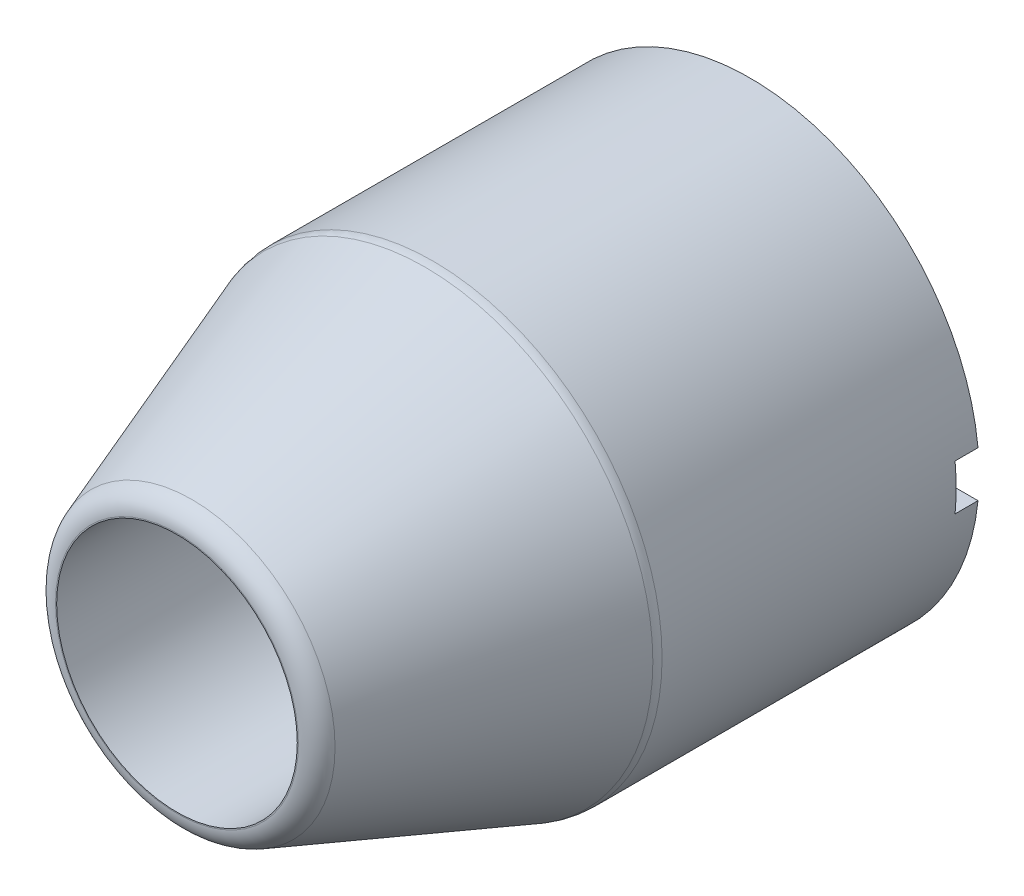
ISO-10303-21;
HEADER;
FILE_DESCRIPTION(('STEP AP214'),'2;1');
FILE_NAME('part.step','',(''),(''),'','','');
FILE_SCHEMA(('AUTOMOTIVE_DESIGN { 1 0 10303 214 1 1 1 1 }'));
ENDSEC;
DATA;
#1=APPLICATION_CONTEXT('core data for automotive mechanical design processes');
#2=APPLICATION_PROTOCOL_DEFINITION('international standard','automotive_design',2000,#1);
#3=PRODUCT_CONTEXT('',#1,'mechanical');
#4=PRODUCT('Part','Part','',(#3));
#5=PRODUCT_RELATED_PRODUCT_CATEGORY('part','',(#4));
#6=PRODUCT_DEFINITION_FORMATION('','',#4);
#7=PRODUCT_DEFINITION_CONTEXT('part definition',#1,'design');
#8=PRODUCT_DEFINITION('design','',#6,#7);
#9=PRODUCT_DEFINITION_SHAPE('','',#8);
#10=(LENGTH_UNIT() NAMED_UNIT(*) SI_UNIT(.MILLI.,.METRE.));
#11=(NAMED_UNIT(*) PLANE_ANGLE_UNIT() SI_UNIT($,.RADIAN.));
#12=(NAMED_UNIT(*) SI_UNIT($,.STERADIAN.) SOLID_ANGLE_UNIT());
#13=UNCERTAINTY_MEASURE_WITH_UNIT(LENGTH_MEASURE(1.E-05),#10,'distance_accuracy_value','');
#14=(GEOMETRIC_REPRESENTATION_CONTEXT(3) GLOBAL_UNCERTAINTY_ASSIGNED_CONTEXT((#13)) GLOBAL_UNIT_ASSIGNED_CONTEXT((#10,
#11,#12)) REPRESENTATION_CONTEXT('',''));
#15=CARTESIAN_POINT('',(0.,0.,0.));
#16=DIRECTION('',(0.,0.,1.));
#17=DIRECTION('',(1.,0.,0.));
#18=AXIS2_PLACEMENT_3D('',#15,#16,#17);
#19=CARTESIAN_POINT('',(0.,0.,0.));
#20=DIRECTION('',(0.,0.,1.));
#21=DIRECTION('',(1.,0.,0.));
#22=AXIS2_PLACEMENT_3D('',#19,#20,#21);
#23=PLANE('',#22);
#24=CARTESIAN_POINT('',(0.,0.,0.));
#25=DIRECTION('',(0.,0.,1.));
#26=DIRECTION('',(1.,0.,0.));
#27=AXIS2_PLACEMENT_3D('',#24,#25,#26);
#28=CIRCLE('',#27,10.);
#29=CARTESIAN_POINT('',(-9.9498743710662,-1.,0.));
#30=VERTEX_POINT('',#29);
#31=CARTESIAN_POINT('',(9.9498743710662,-1.,0.));
#32=VERTEX_POINT('',#31);
#33=EDGE_CURVE('E137',#30,#32,#28,.T.);
#34=ORIENTED_EDGE('',*,*,#33,.F.);
#35=DIRECTION('',(-1.,0.,0.));
#36=VECTOR('',#35,1.);
#37=CARTESIAN_POINT('',(11.2328509612834,-1.,0.));
#38=LINE('',#37,#36);
#39=CARTESIAN_POINT('',(-3.87298334620742,-1.,0.));
#40=VERTEX_POINT('',#39);
#41=EDGE_CURVE('E128',#40,#30,#38,.T.);
#42=ORIENTED_EDGE('',*,*,#41,.F.);
#43=CARTESIAN_POINT('',(0.,0.,0.));
#44=DIRECTION('',(0.,0.,1.));
#45=DIRECTION('',(1.,0.,0.));
#46=AXIS2_PLACEMENT_3D('',#43,#44,#45);
#47=CIRCLE('',#46,4.);
#48=CARTESIAN_POINT('',(3.87298334620742,-1.,0.));
#49=VERTEX_POINT('',#48);
#50=EDGE_CURVE('E136',#40,#49,#47,.T.);
#51=ORIENTED_EDGE('',*,*,#50,.T.);
#52=EDGE_CURVE('E226',#32,#49,#38,.T.);
#53=ORIENTED_EDGE('',*,*,#52,.F.);
#54=EDGE_LOOP('',(#34,#42,#51,#53));
#55=FACE_BOUND('',#54,.T.);
#56=ADVANCED_FACE('F39',(#55),#23,.F.);
#57=CARTESIAN_POINT('',(0.,0.,0.));
#58=DIRECTION('',(0.,0.,1.));
#59=DIRECTION('',(1.,0.,0.));
#60=AXIS2_PLACEMENT_3D('',#57,#58,#59);
#61=CYLINDRICAL_SURFACE('',#60,2.);
#62=CARTESIAN_POINT('',(0.,0.,2.00000000000001));
#63=DIRECTION('',(0.,0.,1.));
#64=DIRECTION('',(1.,0.,0.));
#65=AXIS2_PLACEMENT_3D('',#62,#63,#64);
#66=CIRCLE('',#65,2.);
#67=CARTESIAN_POINT('',(2.,0.,2.00000000000001));
#68=VERTEX_POINT('',#67);
#69=EDGE_CURVE('E149',#68,#68,#66,.F.);
#70=ORIENTED_EDGE('',*,*,#69,.T.);
#71=EDGE_LOOP('',(#70));
#72=FACE_BOUND('',#71,.T.);
#73=CARTESIAN_POINT('',(0.,0.,17.));
#74=DIRECTION('',(0.,0.,1.));
#75=DIRECTION('',(1.,0.,0.));
#76=AXIS2_PLACEMENT_3D('',#73,#74,#75);
#77=CIRCLE('',#76,2.);
#78=CARTESIAN_POINT('',(2.,0.,17.));
#79=VERTEX_POINT('',#78);
#80=EDGE_CURVE('E141',#79,#79,#77,.F.);
#81=ORIENTED_EDGE('',*,*,#80,.F.);
#82=EDGE_LOOP('',(#81));
#83=FACE_BOUND('',#82,.T.);
#84=ADVANCED_FACE('F196',(#72,#83),#61,.F.);
#85=CARTESIAN_POINT('',(0.,0.,25.));
#86=DIRECTION('',(0.,0.,-1.));
#87=DIRECTION('',(-1.,0.,0.));
#88=AXIS2_PLACEMENT_3D('',#85,#86,#87);
#89=CYLINDRICAL_SURFACE('',#88,10.);
#90=ORIENTED_EDGE('',*,*,#33,.T.);
#91=DIRECTION('',(0.,0.,-1.));
#92=VECTOR('',#91,1.);
#93=CARTESIAN_POINT('',(9.9498743710662,-1.,25.));
#94=LINE('',#93,#92);
#95=CARTESIAN_POINT('',(9.9498743710662,-1.,1.));
#96=VERTEX_POINT('',#95);
#97=EDGE_CURVE('E229',#32,#96,#94,.F.);
#98=ORIENTED_EDGE('',*,*,#97,.T.);
#99=CARTESIAN_POINT('',(0.,0.,1.));
#100=DIRECTION('',(0.,0.,-1.));
#101=DIRECTION('',(-1.,0.,0.));
#102=AXIS2_PLACEMENT_3D('',#99,#100,#101);
#103=CIRCLE('',#102,10.);
#104=CARTESIAN_POINT('',(9.9498743710662,1.,1.));
#105=VERTEX_POINT('',#104);
#106=EDGE_CURVE('E118',#105,#96,#103,.T.);
#107=ORIENTED_EDGE('',*,*,#106,.F.);
#108=DIRECTION('',(0.,0.,-1.));
#109=VECTOR('',#108,1.);
#110=CARTESIAN_POINT('',(9.9498743710662,1.,25.));
#111=LINE('',#110,#109);
#112=CARTESIAN_POINT('',(9.9498743710662,1.,0.));
#113=VERTEX_POINT('',#112);
#114=EDGE_CURVE('E117',#105,#113,#111,.T.);
#115=ORIENTED_EDGE('',*,*,#114,.T.);
#116=CARTESIAN_POINT('',(-9.9498743710662,1.,0.));
#117=VERTEX_POINT('',#116);
#118=EDGE_CURVE('E125',#113,#117,#28,.T.);
#119=ORIENTED_EDGE('',*,*,#118,.T.);
#120=DIRECTION('',(0.,0.,-1.));
#121=VECTOR('',#120,1.);
#122=CARTESIAN_POINT('',(-9.9498743710662,1.,25.));
#123=LINE('',#122,#121);
#124=CARTESIAN_POINT('',(-9.9498743710662,1.,1.));
#125=VERTEX_POINT('',#124);
#126=EDGE_CURVE('E109',#117,#125,#123,.F.);
#127=ORIENTED_EDGE('',*,*,#126,.T.);
#128=CARTESIAN_POINT('',(-9.9498743710662,-1.,1.));
#129=VERTEX_POINT('',#128);
#130=EDGE_CURVE('E231',#129,#125,#103,.T.);
#131=ORIENTED_EDGE('',*,*,#130,.F.);
#132=DIRECTION('',(0.,0.,-1.));
#133=VECTOR('',#132,1.);
#134=CARTESIAN_POINT('',(-9.9498743710662,-1.,25.));
#135=LINE('',#134,#133);
#136=EDGE_CURVE('E230',#129,#30,#135,.T.);
#137=ORIENTED_EDGE('',*,*,#136,.T.);
#138=EDGE_LOOP('',(#90,#98,#107,#115,#119,#127,#131,#137));
#139=FACE_BOUND('',#138,.T.);
#140=CARTESIAN_POINT('',(0.,0.,13.833763341473));
#141=DIRECTION('',(0.,0.,1.));
#142=DIRECTION('',(1.,0.,0.));
#143=AXIS2_PLACEMENT_3D('',#140,#141,#142);
#144=CIRCLE('',#143,10.);
#145=CARTESIAN_POINT('',(10.,0.,13.833763341473));
#146=VERTEX_POINT('',#145);
#147=EDGE_CURVE('E152',#146,#146,#144,.F.);
#148=ORIENTED_EDGE('',*,*,#147,.T.);
#149=EDGE_LOOP('',(#148));
#150=FACE_BOUND('',#149,.T.);
#151=ADVANCED_FACE('F133',(#139,#150),#89,.T.);
#152=CARTESIAN_POINT('',(0.,0.,25.));
#153=DIRECTION('',(0.,0.,1.));
#154=DIRECTION('',(1.,0.,0.));
#155=AXIS2_PLACEMENT_3D('',#152,#153,#154);
#156=PLANE('',#155);
#157=CARTESIAN_POINT('',(0.,0.,25.));
#158=DIRECTION('',(0.,0.,1.));
#159=DIRECTION('',(1.,0.,0.));
#160=AXIS2_PLACEMENT_3D('',#157,#158,#159);
#161=CIRCLE('',#160,5.29979246179028);
#162=CARTESIAN_POINT('',(5.29979246179028,0.,25.));
#163=VERTEX_POINT('',#162);
#164=EDGE_CURVE('E161',#163,#163,#161,.T.);
#165=ORIENTED_EDGE('',*,*,#164,.T.);
#166=EDGE_LOOP('',(#165));
#167=FACE_BOUND('',#166,.T.);
#168=CARTESIAN_POINT('',(0.,0.,25.));
#169=DIRECTION('',(0.,0.,1.));
#170=DIRECTION('',(1.,0.,0.));
#171=AXIS2_PLACEMENT_3D('',#168,#169,#170);
#172=CIRCLE('',#171,5.25);
#173=CARTESIAN_POINT('',(5.25,0.,25.));
#174=VERTEX_POINT('',#173);
#175=EDGE_CURVE('E144',#174,#174,#172,.T.);
#176=ORIENTED_EDGE('',*,*,#175,.F.);
#177=EDGE_LOOP('',(#176));
#178=FACE_BOUND('',#177,.T.);
#179=ADVANCED_FACE('F200',(#167,#178),#156,.T.);
#180=ORIENTED_EDGE('',*,*,#118,.F.);
#181=DIRECTION('',(1.,0.,0.));
#182=VECTOR('',#181,1.);
#183=CARTESIAN_POINT('',(11.2328509612834,1.,0.));
#184=LINE('',#183,#182);
#185=CARTESIAN_POINT('',(3.87298334620742,1.,0.));
#186=VERTEX_POINT('',#185);
#187=EDGE_CURVE('E129',#186,#113,#184,.T.);
#188=ORIENTED_EDGE('',*,*,#187,.F.);
#189=CARTESIAN_POINT('',(-3.87298334620742,1.,0.));
#190=VERTEX_POINT('',#189);
#191=EDGE_CURVE('E127',#186,#190,#47,.T.);
#192=ORIENTED_EDGE('',*,*,#191,.T.);
#193=EDGE_CURVE('E112',#117,#190,#184,.T.);
#194=ORIENTED_EDGE('',*,*,#193,.F.);
#195=EDGE_LOOP('',(#180,#188,#192,#194));
#196=FACE_BOUND('',#195,.T.);
#197=ADVANCED_FACE('F123',(#196),#23,.F.);
#198=CARTESIAN_POINT('',(0.,0.,17.));
#199=DIRECTION('',(0.,0.,1.));
#200=DIRECTION('',(1.,0.,0.));
#201=AXIS2_PLACEMENT_3D('',#198,#199,#200);
#202=PLANE('',#201);
#203=CARTESIAN_POINT('',(0.,0.,17.));
#204=DIRECTION('',(0.,0.,1.));
#205=DIRECTION('',(1.,0.,0.));
#206=AXIS2_PLACEMENT_3D('',#203,#204,#205);
#207=CIRCLE('',#206,5.25);
#208=CARTESIAN_POINT('',(5.25,0.,17.));
#209=VERTEX_POINT('',#208);
#210=EDGE_CURVE('E147',#209,#209,#207,.T.);
#211=ORIENTED_EDGE('',*,*,#210,.T.);
#212=EDGE_LOOP('',(#211));
#213=FACE_BOUND('',#212,.T.);
#214=ORIENTED_EDGE('',*,*,#80,.T.);
#215=EDGE_LOOP('',(#214));
#216=FACE_BOUND('',#215,.T.);
#217=ADVANCED_FACE('F187',(#213,#216),#202,.T.);
#218=CARTESIAN_POINT('',(0.,0.,17.));
#219=DIRECTION('',(0.,0.,1.));
#220=DIRECTION('',(1.,0.,0.));
#221=AXIS2_PLACEMENT_3D('',#218,#219,#220);
#222=CYLINDRICAL_SURFACE('',#221,5.25);
#223=ORIENTED_EDGE('',*,*,#210,.F.);
#224=EDGE_LOOP('',(#223));
#225=FACE_BOUND('',#224,.T.);
#226=ORIENTED_EDGE('',*,*,#175,.T.);
#227=EDGE_LOOP('',(#226));
#228=FACE_BOUND('',#227,.T.);
#229=ADVANCED_FACE('F190',(#225,#228),#222,.F.);
#230=CARTESIAN_POINT('',(0.,0.,25.));
#231=DIRECTION('',(0.,0.,-1.));
#232=DIRECTION('',(-1.,0.,0.));
#233=AXIS2_PLACEMENT_3D('',#230,#231,#232);
#234=CONICAL_SURFACE('',#233,5.99999999999999,0.349065850398867);
#235=CARTESIAN_POINT('',(0.,0.,14.1757834847987));
#236=DIRECTION('',(0.,0.,-1.));
#237=DIRECTION('',(-1.,0.,0.));
#238=AXIS2_PLACEMENT_3D('',#235,#236,#237);
#239=CIRCLE('',#238,9.93969262078591);
#240=CARTESIAN_POINT('',(-9.93969262078591,0.,14.1757834847987));
#241=VERTEX_POINT('',#240);
#242=EDGE_CURVE('E158',#241,#241,#239,.F.);
#243=ORIENTED_EDGE('',*,*,#242,.T.);
#244=EDGE_LOOP('',(#243));
#245=FACE_BOUND('',#244,.T.);
#246=CARTESIAN_POINT('',(0.,0.,24.3420201433257));
#247=DIRECTION('',(0.,0.,1.));
#248=DIRECTION('',(1.,0.,0.));
#249=AXIS2_PLACEMENT_3D('',#246,#247,#248);
#250=CIRCLE('',#249,6.23948508257619);
#251=CARTESIAN_POINT('',(6.23948508257619,0.,24.3420201433257));
#252=VERTEX_POINT('',#251);
#253=EDGE_CURVE('E155',#252,#252,#250,.F.);
#254=ORIENTED_EDGE('',*,*,#253,.T.);
#255=EDGE_LOOP('',(#254));
#256=FACE_BOUND('',#255,.T.);
#257=ADVANCED_FACE('F194',(#245,#256),#234,.T.);
#258=CARTESIAN_POINT('',(0.,0.,0.));
#259=DIRECTION('',(0.,0.,-1.));
#260=DIRECTION('',(-1.,0.,0.));
#261=AXIS2_PLACEMENT_3D('',#258,#259,#260);
#262=CONICAL_SURFACE('',#261,4.,0.785398163397447);
#263=CARTESIAN_POINT('',(3.87370629888225,-1.,-0.000700000000000094));
#264=CARTESIAN_POINT('',(3.7837784779459,-1.,0.0863718394627444));
#265=CARTESIAN_POINT('',(3.69375826152483,-1.,0.173347957437473));
#266=CARTESIAN_POINT('',(3.51348257523247,-1.,0.347058438705949));
#267=CARTESIAN_POINT('',(3.4232271022008,-1.,0.433792798719256));
#268=CARTESIAN_POINT('',(3.15193307704454,-1.,0.69365259159612));
#269=CARTESIAN_POINT('',(2.97046894641195,-1.,0.866335724352442));
#270=CARTESIAN_POINT('',(2.69877195793615,-1.,1.12207018887305));
#271=CARTESIAN_POINT('',(2.609252782903,-1.,1.20587939930323));
#272=CARTESIAN_POINT('',(2.42961319121393,-1.,1.37285042617686));
#273=CARTESIAN_POINT('',(2.3394927801879,-1.,1.45601224866658));
#274=CARTESIAN_POINT('',(2.15846162379623,-1.,1.62142806959819));
#275=CARTESIAN_POINT('',(2.06755107551998,-1.,1.703682283436));
#276=CARTESIAN_POINT('',(1.88460197739567,-1.,1.8669256868062));
#277=CARTESIAN_POINT('',(1.79256347284045,-1.,1.94791492683825));
#278=CARTESIAN_POINT('',(1.64554639333565,-1.,2.07462313424883));
#279=CARTESIAN_POINT('',(1.59111153800496,-1.,2.12097217358485));
#280=CARTESIAN_POINT('',(1.48151988478835,-1.,2.21282217769493));
#281=CARTESIAN_POINT('',(1.42636301716188,-1.,2.25832305949945));
#282=CARTESIAN_POINT('',(1.31452536495843,-1.,2.34867399855443));
#283=CARTESIAN_POINT('',(1.25783454923194,-1.,2.39351168839675));
#284=CARTESIAN_POINT('',(1.14321925252984,-1.,2.4815788156897));
#285=CARTESIAN_POINT('',(1.08529490458926,-1.,2.52480842520246));
#286=CARTESIAN_POINT('',(0.966870518316496,-1.,2.60964060994583));
#287=CARTESIAN_POINT('',(0.906344320623984,-1.,2.6512069898277));
#288=CARTESIAN_POINT('',(0.782893162532473,-1.,2.73086954921073));
#289=CARTESIAN_POINT('',(0.719965087209702,-1.,2.76896098917138));
#290=CARTESIAN_POINT('',(0.591863597012893,-1.,2.83919989257296));
#291=CARTESIAN_POINT('',(0.526729355427913,-1.,2.87141735612767));
#292=CARTESIAN_POINT('',(0.392911859149717,-1.,2.92727855967888));
#293=CARTESIAN_POINT('',(0.32424152990344,-1.,2.95095129931627));
#294=CARTESIAN_POINT('',(0.22118462715874,-1.,2.97632594749514));
#295=CARTESIAN_POINT('',(0.188023002282175,-1.,2.98301400629415));
#296=CARTESIAN_POINT('',(0.12120614201491,-1.,2.99322151550407));
#297=CARTESIAN_POINT('',(0.0875509450036946,-1.,2.99674121096874));
#298=CARTESIAN_POINT('',(0.0201426921737919,-1.,3.00036141154984));
#299=CARTESIAN_POINT('',(-0.0136098619022224,-1.,3.00047102736678));
#300=CARTESIAN_POINT('',(-0.0809476049092293,-1.,2.9972949419107));
#301=CARTESIAN_POINT('',(-0.114532778163746,-1.,2.99400892840058));
#302=CARTESIAN_POINT('',(-0.213951812975929,-1.,2.97944800105436));
#303=CARTESIAN_POINT('',(-0.279130544840006,-1.,2.96349968431124));
#304=CARTESIAN_POINT('',(-0.37462064885794,-1.,2.93256829301381));
#305=CARTESIAN_POINT('',(-0.406166969488615,-1.,2.92104208187237));
#306=CARTESIAN_POINT('',(-0.468488884656914,-1.,2.89606468735604));
#307=CARTESIAN_POINT('',(-0.499264640104028,-1.,2.88261390987553));
#308=CARTESIAN_POINT('',(-0.592440527855128,-1.,2.83901301817912));
#309=CARTESIAN_POINT('',(-0.653643966712837,-1.,2.80632376154979));
#310=CARTESIAN_POINT('',(-0.77358116765254,-1.,2.73665129223336));
#311=CARTESIAN_POINT('',(-0.832311709344524,-1.,2.69966270271442));
#312=CARTESIAN_POINT('',(-0.948093136294804,-1.,2.62268134263451));
#313=CARTESIAN_POINT('',(-1.00513632967925,-1.,2.58267710491048));
#314=CARTESIAN_POINT('',(-1.11774208035631,-1.,2.5007130927048));
#315=CARTESIAN_POINT('',(-1.17330537205866,-1.,2.45875431770495));
#316=CARTESIAN_POINT('',(-1.28406702690464,-1.,2.37285825083702));
#317=CARTESIAN_POINT('',(-1.33925064997074,-1.,2.32890203973701));
#318=CARTESIAN_POINT('',(-1.4487528597088,-1.,2.23992271405036));
#319=CARTESIAN_POINT('',(-1.50307139372426,-1.,2.19489953493105));
#320=CARTESIAN_POINT('',(-1.66476167209747,-1.,2.05886337265817));
#321=CARTESIAN_POINT('',(-1.77113835083899,-1.,1.96666960122839));
#322=CARTESIAN_POINT('',(-1.96398355631298,-1.,1.79646251810434));
#323=CARTESIAN_POINT('',(-2.0507188259663,-1.,1.71874856148764));
#324=CARTESIAN_POINT('',(-2.22334975381647,-1.,1.56238905184115));
#325=CARTESIAN_POINT('',(-2.30924538899868,-1.,1.4837434734053));
#326=CARTESIAN_POINT('',(-2.56617677190919,-1.,1.24666385868424));
#327=CARTESIAN_POINT('',(-2.73629220768056,-1.,1.08723434072669));
#328=CARTESIAN_POINT('',(-3.06815080889591,-1.,0.77342130419766));
#329=CARTESIAN_POINT('',(-3.22995159688404,-1.,0.619098434759282));
#330=CARTESIAN_POINT('',(-3.47190857421326,-1.,0.387018628604524));
#331=CARTESIAN_POINT('',(-3.55239220239384,-1.,0.309602768680224));
#332=CARTESIAN_POINT('',(-3.71317699014677,-1.,0.154583029028057));
#333=CARTESIAN_POINT('',(-3.79347815114776,-1.,0.076979150782199));
#334=CARTESIAN_POINT('',(-3.87370629888225,-1.,-0.000700000000000002));
#335=B_SPLINE_CURVE_WITH_KNOTS('',3,(#263,#264,#265,#266,#267,#268,#269,#270,#271,#272,#273,
#274,#275,#276,#277,#278,#279,#280,#281,#282,#283,#284,#285,#286,#287,#288,#289,#290,#291,#292,
#293,#294,#295,#296,#297,#298,#299,#300,#301,#302,#303,#304,#305,#306,#307,#308,#309,#310,#311,
#312,#313,#314,#315,#316,#317,#318,#319,#320,#321,#322,#323,#324,#325,#326,#327,#328,#329,#330,
#331,#332,#333,#334),.UNSPECIFIED.,.F.,.F.,(4,2,2,2,2,2,2,2,2,2,2,2,2,2,2,2,2,2,2,2,2,2,2,2,2,2,
2,2,2,2,2,2,2,2,2,4),(0.,0.375521273518929,0.751047617959446,1.5025268221824,1.87040917603003,
2.23828808990823,2.60607773419091,2.97385265803598,3.18832820960986,3.40282463293232,
3.61964172249636,3.83643554583897,4.05663268672296,4.277125803815,4.4947895908717,
4.71170755194002,4.81306564528407,4.91441589851794,5.01549535123517,5.11658409930254,
5.3167507892113,5.41747214081757,5.51817228134098,5.72602902840847,5.93414858038392,
6.14310385848396,6.35195343267415,6.56358726575022,6.77523393175899,7.19749326552378,
7.54686154766356,7.89623937938662,8.59565822619727,9.26644154249653,9.60145985579848,
9.93647553693498),.UNSPECIFIED.);
#336=CARTESIAN_POINT('',(2.82842712474619,-1.,1.));
#337=VERTEX_POINT('',#336);
#338=EDGE_CURVE('E11',#49,#337,#335,.T.);
#339=ORIENTED_EDGE('',*,*,#338,.F.);
#340=ORIENTED_EDGE('',*,*,#50,.F.);
#341=CARTESIAN_POINT('',(-2.82842712474619,-1.,1.));
#342=VERTEX_POINT('',#341);
#343=EDGE_CURVE('E43',#342,#40,#335,.T.);
#344=ORIENTED_EDGE('',*,*,#343,.F.);
#345=CARTESIAN_POINT('',(0.,0.,1.));
#346=DIRECTION('',(0.,0.,-1.));
#347=DIRECTION('',(-1.,0.,0.));
#348=AXIS2_PLACEMENT_3D('',#345,#346,#347);
#349=CIRCLE('',#348,3.);
#350=CARTESIAN_POINT('',(-2.82842712474619,1.,1.));
#351=VERTEX_POINT('',#350);
#352=EDGE_CURVE('E164',#342,#351,#349,.T.);
#353=ORIENTED_EDGE('',*,*,#352,.T.);
#354=CARTESIAN_POINT('',(-3.87370629888225,1.,-0.000700000000000094));
#355=CARTESIAN_POINT('',(-3.7837784779459,1.,0.086371839462744));
#356=CARTESIAN_POINT('',(-3.69375826152483,1.,0.173347957437473));
#357=CARTESIAN_POINT('',(-3.51348257523247,1.,0.347058438705948));
#358=CARTESIAN_POINT('',(-3.4232271022008,1.,0.433792798719256));
#359=CARTESIAN_POINT('',(-3.15193307704454,1.,0.69365259159612));
#360=CARTESIAN_POINT('',(-2.97046894641195,1.,0.86633572435244));
#361=CARTESIAN_POINT('',(-2.69877195793615,1.,1.12207018887304));
#362=CARTESIAN_POINT('',(-2.609252782903,1.,1.20587939930323));
#363=CARTESIAN_POINT('',(-2.42961319121394,1.,1.37285042617685));
#364=CARTESIAN_POINT('',(-2.3394927801879,1.,1.45601224866658));
#365=CARTESIAN_POINT('',(-2.15846162379623,1.,1.62142806959818));
#366=CARTESIAN_POINT('',(-2.06755107551998,1.,1.703682283436));
#367=CARTESIAN_POINT('',(-1.88460197739568,1.,1.8669256868062));
#368=CARTESIAN_POINT('',(-1.79256347284045,1.,1.94791492683825));
#369=CARTESIAN_POINT('',(-1.64554639333565,1.,2.07462313424883));
#370=CARTESIAN_POINT('',(-1.59111153800496,1.,2.12097217358485));
#371=CARTESIAN_POINT('',(-1.48151988478835,1.,2.21282217769493));
#372=CARTESIAN_POINT('',(-1.42636301716188,1.,2.25832305949945));
#373=CARTESIAN_POINT('',(-1.31452536495843,1.,2.34867399855443));
#374=CARTESIAN_POINT('',(-1.25783454923194,1.,2.39351168839675));
#375=CARTESIAN_POINT('',(-1.14321925252984,1.,2.4815788156897));
#376=CARTESIAN_POINT('',(-1.08529490458926,1.,2.52480842520246));
#377=CARTESIAN_POINT('',(-0.966870518316496,1.,2.60964060994583));
#378=CARTESIAN_POINT('',(-0.906344320623984,1.,2.6512069898277));
#379=CARTESIAN_POINT('',(-0.782893162532474,1.,2.73086954921073));
#380=CARTESIAN_POINT('',(-0.719965087209702,1.,2.76896098917138));
#381=CARTESIAN_POINT('',(-0.591863597012893,1.,2.83919989257296));
#382=CARTESIAN_POINT('',(-0.526729355427913,1.,2.87141735612767));
#383=CARTESIAN_POINT('',(-0.392911859149716,1.,2.92727855967888));
#384=CARTESIAN_POINT('',(-0.324241529903439,1.,2.95095129931627));
#385=CARTESIAN_POINT('',(-0.22118462715874,1.,2.97632594749514));
#386=CARTESIAN_POINT('',(-0.188023002282175,1.,2.98301400629415));
#387=CARTESIAN_POINT('',(-0.12120614201491,1.,2.99322151550407));
#388=CARTESIAN_POINT('',(-0.0875509450036944,1.,2.99674121096874));
#389=CARTESIAN_POINT('',(-0.0201426921737918,1.,3.00036141154984));
#390=CARTESIAN_POINT('',(0.0136098619022226,1.,3.00047102736678));
#391=CARTESIAN_POINT('',(0.0809476049092294,1.,2.9972949419107));
#392=CARTESIAN_POINT('',(0.114532778163746,1.,2.99400892840058));
#393=CARTESIAN_POINT('',(0.213951812975929,1.,2.97944800105436));
#394=CARTESIAN_POINT('',(0.279130544840006,1.,2.96349968431124));
#395=CARTESIAN_POINT('',(0.374620648857939,1.,2.93256829301381));
#396=CARTESIAN_POINT('',(0.406166969488615,1.,2.92104208187237));
#397=CARTESIAN_POINT('',(0.468488884656914,1.,2.89606468735604));
#398=CARTESIAN_POINT('',(0.499264640104028,1.,2.88261390987553));
#399=CARTESIAN_POINT('',(0.592440527855129,1.,2.83901301817912));
#400=CARTESIAN_POINT('',(0.653643966712838,1.,2.80632376154979));
#401=CARTESIAN_POINT('',(0.77358116765254,1.,2.73665129223336));
#402=CARTESIAN_POINT('',(0.832311709344524,1.,2.69966270271442));
#403=CARTESIAN_POINT('',(0.948093136294804,1.,2.62268134263451));
#404=CARTESIAN_POINT('',(1.00513632967925,1.,2.58267710491048));
#405=CARTESIAN_POINT('',(1.11774208035631,1.,2.5007130927048));
#406=CARTESIAN_POINT('',(1.17330537205867,1.,2.45875431770495));
#407=CARTESIAN_POINT('',(1.28406702690464,1.,2.37285825083702));
#408=CARTESIAN_POINT('',(1.33925064997074,1.,2.32890203973701));
#409=CARTESIAN_POINT('',(1.4487528597088,1.,2.23992271405036));
#410=CARTESIAN_POINT('',(1.50307139372426,1.,2.19489953493105));
#411=CARTESIAN_POINT('',(1.66476167209747,1.,2.05886337265817));
#412=CARTESIAN_POINT('',(1.77113835083899,1.,1.96666960122839));
#413=CARTESIAN_POINT('',(1.96398355631298,1.,1.79646251810434));
#414=CARTESIAN_POINT('',(2.0507188259663,1.,1.71874856148764));
#415=CARTESIAN_POINT('',(2.22334975381647,1.,1.56238905184115));
#416=CARTESIAN_POINT('',(2.30924538899868,1.,1.4837434734053));
#417=CARTESIAN_POINT('',(2.56617677190919,1.,1.24666385868424));
#418=CARTESIAN_POINT('',(2.73629220768057,1.,1.08723434072668));
#419=CARTESIAN_POINT('',(3.06815080889591,1.,0.773421304197659));
#420=CARTESIAN_POINT('',(3.22995159688404,1.,0.619098434759281));
#421=CARTESIAN_POINT('',(3.47190857421326,1.,0.387018628604523));
#422=CARTESIAN_POINT('',(3.55239220239384,1.,0.309602768680223));
#423=CARTESIAN_POINT('',(3.71317699014677,1.,0.154583029028057));
#424=CARTESIAN_POINT('',(3.79347815114776,1.,0.0769791507821991));
#425=CARTESIAN_POINT('',(3.87370629888225,1.,-0.000700000000000022));
#426=B_SPLINE_CURVE_WITH_KNOTS('',3,(#354,#355,#356,#357,#358,#359,#360,#361,#362,#363,#364,
#365,#366,#367,#368,#369,#370,#371,#372,#373,#374,#375,#376,#377,#378,#379,#380,#381,#382,#383,
#384,#385,#386,#387,#388,#389,#390,#391,#392,#393,#394,#395,#396,#397,#398,#399,#400,#401,#402,
#403,#404,#405,#406,#407,#408,#409,#410,#411,#412,#413,#414,#415,#416,#417,#418,#419,#420,#421,
#422,#423,#424,#425),.UNSPECIFIED.,.F.,.F.,(4,2,2,2,2,2,2,2,2,2,2,2,2,2,2,2,2,2,2,2,2,2,2,2,2,2,
2,2,2,2,2,2,2,2,2,4),(0.,0.375521273518929,0.751047617959446,1.5025268221824,1.87040917603003,
2.23828808990823,2.60607773419091,2.97385265803598,3.18832820960986,3.40282463293233,
3.61964172249636,3.83643554583897,4.05663268672296,4.277125803815,4.4947895908717,
4.71170755194002,4.81306564528407,4.91441589851794,5.01549535123517,5.11658409930254,
5.3167507892113,5.41747214081757,5.51817228134098,5.72602902840847,5.93414858038392,
6.14310385848396,6.35195343267415,6.56358726575022,6.77523393175899,7.19749326552378,
7.54686154766357,7.89623937938663,8.59565822619728,9.26644154249654,9.60145985579848,
9.93647553693498),.UNSPECIFIED.);
#427=EDGE_CURVE('E166',#190,#351,#426,.T.);
#428=ORIENTED_EDGE('',*,*,#427,.F.);
#429=ORIENTED_EDGE('',*,*,#191,.F.);
#430=CARTESIAN_POINT('',(2.82842712474619,1.,1.));
#431=VERTEX_POINT('',#430);
#432=EDGE_CURVE('E54',#431,#186,#426,.T.);
#433=ORIENTED_EDGE('',*,*,#432,.F.);
#434=EDGE_CURVE('E167',#431,#337,#349,.T.);
#435=ORIENTED_EDGE('',*,*,#434,.T.);
#436=EDGE_LOOP('',(#339,#340,#344,#353,#428,#429,#433,#435));
#437=FACE_BOUND('',#436,.T.);
#438=ORIENTED_EDGE('',*,*,#69,.F.);
#439=EDGE_LOOP('',(#438));
#440=FACE_BOUND('',#439,.T.);
#441=ADVANCED_FACE('F174',(#437,#440),#262,.F.);
#442=CARTESIAN_POINT('',(0.,0.,13.833763341473));
#443=DIRECTION('',(0.,0.,1.));
#444=DIRECTION('',(1.,0.,0.));
#445=AXIS2_PLACEMENT_3D('',#442,#443,#444);
#446=TOROIDAL_SURFACE('',#445,9.,1.);
#447=ORIENTED_EDGE('',*,*,#242,.F.);
#448=EDGE_LOOP('',(#447));
#449=FACE_BOUND('',#448,.T.);
#450=ORIENTED_EDGE('',*,*,#147,.F.);
#451=EDGE_LOOP('',(#450));
#452=FACE_BOUND('',#451,.T.);
#453=ADVANCED_FACE('F215',(#449,#452),#446,.T.);
#454=CARTESIAN_POINT('',(0.,0.,24.));
#455=DIRECTION('',(0.,0.,1.));
#456=DIRECTION('',(1.,0.,0.));
#457=AXIS2_PLACEMENT_3D('',#454,#455,#456);
#458=TOROIDAL_SURFACE('',#457,5.29979246179028,1.);
#459=ORIENTED_EDGE('',*,*,#253,.F.);
#460=EDGE_LOOP('',(#459));
#461=FACE_BOUND('',#460,.T.);
#462=ORIENTED_EDGE('',*,*,#164,.F.);
#463=EDGE_LOOP('',(#462));
#464=FACE_BOUND('',#463,.T.);
#465=ADVANCED_FACE('F41',(#461,#464),#458,.T.);
#466=CARTESIAN_POINT('',(0.,0.,1.));
#467=DIRECTION('',(0.,0.,-1.));
#468=DIRECTION('',(-1.,0.,0.));
#469=AXIS2_PLACEMENT_3D('',#466,#467,#468);
#470=PLANE('',#469);
#471=ORIENTED_EDGE('',*,*,#130,.T.);
#472=DIRECTION('',(1.,0.,0.));
#473=VECTOR('',#472,1.);
#474=CARTESIAN_POINT('',(11.2328509612834,1.,1.));
#475=LINE('',#474,#473);
#476=EDGE_CURVE('E68',#125,#351,#475,.T.);
#477=ORIENTED_EDGE('',*,*,#476,.T.);
#478=ORIENTED_EDGE('',*,*,#352,.F.);
#479=DIRECTION('',(-1.,0.,0.));
#480=VECTOR('',#479,1.);
#481=CARTESIAN_POINT('',(11.2328509612834,-1.,1.));
#482=LINE('',#481,#480);
#483=EDGE_CURVE('E250',#342,#129,#482,.T.);
#484=ORIENTED_EDGE('',*,*,#483,.T.);
#485=EDGE_LOOP('',(#471,#477,#478,#484));
#486=FACE_BOUND('',#485,.T.);
#487=ADVANCED_FACE('F261',(#486),#470,.T.);
#488=CARTESIAN_POINT('',(11.2328509612834,1.,1.));
#489=DIRECTION('',(0.,1.,0.));
#490=DIRECTION('',(0.,0.,1.));
#491=AXIS2_PLACEMENT_3D('',#488,#489,#490);
#492=PLANE('',#491);
#493=ORIENTED_EDGE('',*,*,#193,.T.);
#494=ORIENTED_EDGE('',*,*,#427,.T.);
#495=ORIENTED_EDGE('',*,*,#476,.F.);
#496=ORIENTED_EDGE('',*,*,#126,.F.);
#497=EDGE_LOOP('',(#493,#494,#495,#496));
#498=FACE_BOUND('',#497,.T.);
#499=ADVANCED_FACE('F111',(#498),#492,.F.);
#500=CARTESIAN_POINT('',(11.2328509612834,-1.,1.));
#501=DIRECTION('',(0.,-1.,0.));
#502=DIRECTION('',(0.,0.,-1.));
#503=AXIS2_PLACEMENT_3D('',#500,#501,#502);
#504=PLANE('',#503);
#505=ORIENTED_EDGE('',*,*,#483,.F.);
#506=ORIENTED_EDGE('',*,*,#343,.T.);
#507=ORIENTED_EDGE('',*,*,#41,.T.);
#508=ORIENTED_EDGE('',*,*,#136,.F.);
#509=EDGE_LOOP('',(#505,#506,#507,#508));
#510=FACE_BOUND('',#509,.T.);
#511=ADVANCED_FACE('F184',(#510),#504,.F.);
#512=ORIENTED_EDGE('',*,*,#52,.T.);
#513=ORIENTED_EDGE('',*,*,#338,.T.);
#514=EDGE_CURVE('E61',#96,#337,#482,.T.);
#515=ORIENTED_EDGE('',*,*,#514,.F.);
#516=ORIENTED_EDGE('',*,*,#97,.F.);
#517=EDGE_LOOP('',(#512,#513,#515,#516));
#518=FACE_BOUND('',#517,.T.);
#519=ADVANCED_FACE('F182',(#518),#504,.F.);
#520=EDGE_CURVE('E252',#431,#105,#475,.T.);
#521=ORIENTED_EDGE('',*,*,#520,.F.);
#522=ORIENTED_EDGE('',*,*,#432,.T.);
#523=ORIENTED_EDGE('',*,*,#187,.T.);
#524=ORIENTED_EDGE('',*,*,#114,.F.);
#525=EDGE_LOOP('',(#521,#522,#523,#524));
#526=FACE_BOUND('',#525,.T.);
#527=ADVANCED_FACE('F177',(#526),#492,.F.);
#528=ORIENTED_EDGE('',*,*,#106,.T.);
#529=ORIENTED_EDGE('',*,*,#514,.T.);
#530=ORIENTED_EDGE('',*,*,#434,.F.);
#531=ORIENTED_EDGE('',*,*,#520,.T.);
#532=EDGE_LOOP('',(#528,#529,#530,#531));
#533=FACE_BOUND('',#532,.T.);
#534=ADVANCED_FACE('F181',(#533),#470,.T.);
#535=CLOSED_SHELL('',(#56,#84,#151,#179,#197,#217,#229,#257,#441,#453,#465,#487,#499,#511,#519,
#527,#534));
#536=MANIFOLD_SOLID_BREP('B2',#535);
#537=ADVANCED_BREP_SHAPE_REPRESENTATION('',(#18,#536),#14);
#538=SHAPE_DEFINITION_REPRESENTATION(#9,#537);
ENDSEC;
END-ISO-10303-21;
